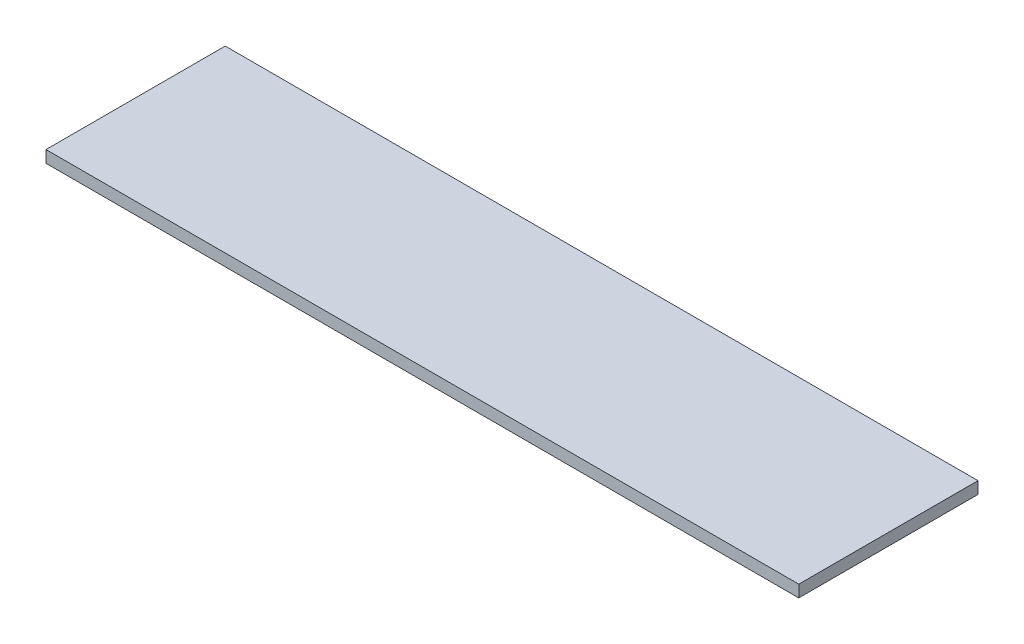
ISO-10303-21;
HEADER;
FILE_DESCRIPTION(('STEP AP214'),'2;1');
FILE_NAME('part.step','',(''),(''),'','','');
FILE_SCHEMA(('AUTOMOTIVE_DESIGN { 1 0 10303 214 1 1 1 1 }'));
ENDSEC;
DATA;
#1=APPLICATION_CONTEXT('core data for automotive mechanical design processes');
#2=APPLICATION_PROTOCOL_DEFINITION('international standard','automotive_design',2000,#1);
#3=PRODUCT_CONTEXT('',#1,'mechanical');
#4=PRODUCT('Part','Part','',(#3));
#5=PRODUCT_RELATED_PRODUCT_CATEGORY('part','',(#4));
#6=PRODUCT_DEFINITION_FORMATION('','',#4);
#7=PRODUCT_DEFINITION_CONTEXT('part definition',#1,'design');
#8=PRODUCT_DEFINITION('design','',#6,#7);
#9=PRODUCT_DEFINITION_SHAPE('','',#8);
#10=(LENGTH_UNIT() NAMED_UNIT(*) SI_UNIT(.MILLI.,.METRE.));
#11=(NAMED_UNIT(*) PLANE_ANGLE_UNIT() SI_UNIT($,.RADIAN.));
#12=(NAMED_UNIT(*) SI_UNIT($,.STERADIAN.) SOLID_ANGLE_UNIT());
#13=UNCERTAINTY_MEASURE_WITH_UNIT(LENGTH_MEASURE(1.E-05),#10,'distance_accuracy_value','');
#14=(GEOMETRIC_REPRESENTATION_CONTEXT(3) GLOBAL_UNCERTAINTY_ASSIGNED_CONTEXT((#13)) GLOBAL_UNIT_ASSIGNED_CONTEXT((#10,
#11,#12)) REPRESENTATION_CONTEXT('',''));
#15=CARTESIAN_POINT('',(0.,0.,0.));
#16=DIRECTION('',(0.,0.,1.));
#17=DIRECTION('',(1.,0.,0.));
#18=AXIS2_PLACEMENT_3D('',#15,#16,#17);
#19=CARTESIAN_POINT('',(0.,12.7,0.));
#20=DIRECTION('',(1.,0.,0.));
#21=DIRECTION('',(0.,0.,-1.));
#22=AXIS2_PLACEMENT_3D('',#19,#20,#21);
#23=PLANE('',#22);
#24=DIRECTION('',(0.,0.,1.));
#25=VECTOR('',#24,1.);
#26=CARTESIAN_POINT('',(0.,0.,0.));
#27=LINE('',#26,#25);
#28=CARTESIAN_POINT('',(0.,0.,-190.5));
#29=VERTEX_POINT('',#28);
#30=CARTESIAN_POINT('',(0.,0.,0.));
#31=VERTEX_POINT('',#30);
#32=EDGE_CURVE('E113',#29,#31,#27,.T.);
#33=ORIENTED_EDGE('',*,*,#32,.T.);
#34=DIRECTION('',(0.,-1.,0.));
#35=VECTOR('',#34,1.);
#36=CARTESIAN_POINT('',(0.,12.7,0.));
#37=LINE('',#36,#35);
#38=CARTESIAN_POINT('',(0.,12.7,0.));
#39=VERTEX_POINT('',#38);
#40=EDGE_CURVE('E11',#39,#31,#37,.T.);
#41=ORIENTED_EDGE('',*,*,#40,.F.);
#42=DIRECTION('',(0.,0.,1.));
#43=VECTOR('',#42,1.);
#44=CARTESIAN_POINT('',(0.,12.7,0.));
#45=LINE('',#44,#43);
#46=CARTESIAN_POINT('',(0.,12.7,-190.5));
#47=VERTEX_POINT('',#46);
#48=EDGE_CURVE('E97',#47,#39,#45,.T.);
#49=ORIENTED_EDGE('',*,*,#48,.F.);
#50=DIRECTION('',(0.,-1.,0.));
#51=VECTOR('',#50,1.);
#52=CARTESIAN_POINT('',(0.,12.7,-190.5));
#53=LINE('',#52,#51);
#54=EDGE_CURVE('E109',#47,#29,#53,.T.);
#55=ORIENTED_EDGE('',*,*,#54,.T.);
#56=EDGE_LOOP('',(#33,#41,#49,#55));
#57=FACE_BOUND('',#56,.T.);
#58=ADVANCED_FACE('F45',(#57),#23,.F.);
#59=CARTESIAN_POINT('',(0.,12.7,0.));
#60=DIRECTION('',(0.,0.,-1.));
#61=DIRECTION('',(-1.,0.,0.));
#62=AXIS2_PLACEMENT_3D('',#59,#60,#61);
#63=PLANE('',#62);
#64=DIRECTION('',(1.,0.,0.));
#65=VECTOR('',#64,1.);
#66=CARTESIAN_POINT('',(0.,0.,0.));
#67=LINE('',#66,#65);
#68=CARTESIAN_POINT('',(800.1,0.,0.));
#69=VERTEX_POINT('',#68);
#70=EDGE_CURVE('E102',#31,#69,#67,.T.);
#71=ORIENTED_EDGE('',*,*,#70,.T.);
#72=DIRECTION('',(0.,-1.,0.));
#73=VECTOR('',#72,1.);
#74=CARTESIAN_POINT('',(800.1,12.7,0.));
#75=LINE('',#74,#73);
#76=CARTESIAN_POINT('',(800.1,12.7,0.));
#77=VERTEX_POINT('',#76);
#78=EDGE_CURVE('E54',#77,#69,#75,.T.);
#79=ORIENTED_EDGE('',*,*,#78,.F.);
#80=DIRECTION('',(1.,0.,0.));
#81=VECTOR('',#80,1.);
#82=CARTESIAN_POINT('',(0.,12.7,0.));
#83=LINE('',#82,#81);
#84=EDGE_CURVE('E92',#39,#77,#83,.T.);
#85=ORIENTED_EDGE('',*,*,#84,.F.);
#86=ORIENTED_EDGE('',*,*,#40,.T.);
#87=EDGE_LOOP('',(#71,#79,#85,#86));
#88=FACE_BOUND('',#87,.T.);
#89=ADVANCED_FACE('F101',(#88),#63,.F.);
#90=CARTESIAN_POINT('',(800.1,12.7,0.));
#91=DIRECTION('',(-1.,0.,0.));
#92=DIRECTION('',(0.,0.,1.));
#93=AXIS2_PLACEMENT_3D('',#90,#91,#92);
#94=PLANE('',#93);
#95=DIRECTION('',(0.,0.,-1.));
#96=VECTOR('',#95,1.);
#97=CARTESIAN_POINT('',(800.1,0.,0.));
#98=LINE('',#97,#96);
#99=CARTESIAN_POINT('',(800.1,0.,-190.5));
#100=VERTEX_POINT('',#99);
#101=EDGE_CURVE('E79',#69,#100,#98,.T.);
#102=ORIENTED_EDGE('',*,*,#101,.T.);
#103=DIRECTION('',(0.,-1.,0.));
#104=VECTOR('',#103,1.);
#105=CARTESIAN_POINT('',(800.1,12.7,-190.5));
#106=LINE('',#105,#104);
#107=CARTESIAN_POINT('',(800.1,12.7,-190.5));
#108=VERTEX_POINT('',#107);
#109=EDGE_CURVE('E104',#108,#100,#106,.T.);
#110=ORIENTED_EDGE('',*,*,#109,.F.);
#111=DIRECTION('',(0.,0.,-1.));
#112=VECTOR('',#111,1.);
#113=CARTESIAN_POINT('',(800.1,12.7,0.));
#114=LINE('',#113,#112);
#115=EDGE_CURVE('E95',#77,#108,#114,.T.);
#116=ORIENTED_EDGE('',*,*,#115,.F.);
#117=ORIENTED_EDGE('',*,*,#78,.T.);
#118=EDGE_LOOP('',(#102,#110,#116,#117));
#119=FACE_BOUND('',#118,.T.);
#120=ADVANCED_FACE('F105',(#119),#94,.F.);
#121=CARTESIAN_POINT('',(0.,12.7,-190.5));
#122=DIRECTION('',(0.,0.,1.));
#123=DIRECTION('',(1.,0.,0.));
#124=AXIS2_PLACEMENT_3D('',#121,#122,#123);
#125=PLANE('',#124);
#126=DIRECTION('',(-1.,0.,0.));
#127=VECTOR('',#126,1.);
#128=CARTESIAN_POINT('',(0.,0.,-190.5));
#129=LINE('',#128,#127);
#130=EDGE_CURVE('E85',#100,#29,#129,.T.);
#131=ORIENTED_EDGE('',*,*,#130,.T.);
#132=ORIENTED_EDGE('',*,*,#54,.F.);
#133=DIRECTION('',(-1.,0.,0.));
#134=VECTOR('',#133,1.);
#135=CARTESIAN_POINT('',(0.,12.7,-190.5));
#136=LINE('',#135,#134);
#137=EDGE_CURVE('E62',#108,#47,#136,.T.);
#138=ORIENTED_EDGE('',*,*,#137,.F.);
#139=ORIENTED_EDGE('',*,*,#109,.T.);
#140=EDGE_LOOP('',(#131,#132,#138,#139));
#141=FACE_BOUND('',#140,.T.);
#142=ADVANCED_FACE('F126',(#141),#125,.F.);
#143=CARTESIAN_POINT('',(0.,12.7,0.));
#144=DIRECTION('',(0.,-1.,0.));
#145=DIRECTION('',(0.,0.,-1.));
#146=AXIS2_PLACEMENT_3D('',#143,#144,#145);
#147=PLANE('',#146);
#148=ORIENTED_EDGE('',*,*,#48,.T.);
#149=ORIENTED_EDGE('',*,*,#84,.T.);
#150=ORIENTED_EDGE('',*,*,#115,.T.);
#151=ORIENTED_EDGE('',*,*,#137,.T.);
#152=EDGE_LOOP('',(#148,#149,#150,#151));
#153=FACE_BOUND('',#152,.T.);
#154=ADVANCED_FACE('F93',(#153),#147,.F.);
#155=CARTESIAN_POINT('',(0.,0.,0.));
#156=DIRECTION('',(0.,-1.,0.));
#157=DIRECTION('',(0.,0.,-1.));
#158=AXIS2_PLACEMENT_3D('',#155,#156,#157);
#159=PLANE('',#158);
#160=ORIENTED_EDGE('',*,*,#32,.F.);
#161=ORIENTED_EDGE('',*,*,#130,.F.);
#162=ORIENTED_EDGE('',*,*,#101,.F.);
#163=ORIENTED_EDGE('',*,*,#70,.F.);
#164=EDGE_LOOP('',(#160,#161,#162,#163));
#165=FACE_BOUND('',#164,.T.);
#166=ADVANCED_FACE('F129',(#165),#159,.T.);
#167=CLOSED_SHELL('',(#58,#89,#120,#142,#154,#166));
#168=MANIFOLD_SOLID_BREP('B2',#167);
#169=ADVANCED_BREP_SHAPE_REPRESENTATION('',(#18,#168),#14);
#170=SHAPE_DEFINITION_REPRESENTATION(#9,#169);
ENDSEC;
END-ISO-10303-21;
